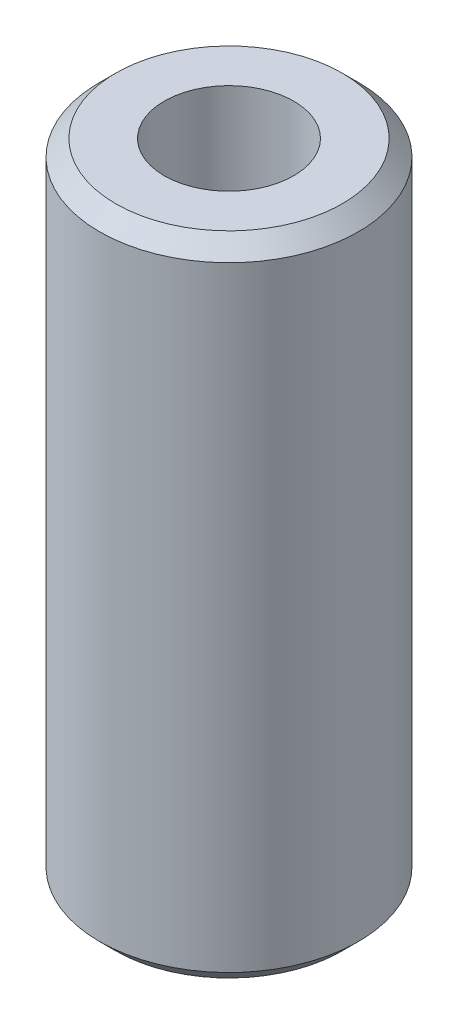
ISO-10303-21;
HEADER;
FILE_DESCRIPTION(('STEP AP214'),'2;1');
FILE_NAME('part.step','',(''),(''),'','','');
FILE_SCHEMA(('AUTOMOTIVE_DESIGN { 1 0 10303 214 1 1 1 1 }'));
ENDSEC;
DATA;
#1=APPLICATION_CONTEXT('core data for automotive mechanical design processes');
#2=APPLICATION_PROTOCOL_DEFINITION('international standard','automotive_design',2000,#1);
#3=PRODUCT_CONTEXT('',#1,'mechanical');
#4=PRODUCT('Part','Part','',(#3));
#5=PRODUCT_RELATED_PRODUCT_CATEGORY('part','',(#4));
#6=PRODUCT_DEFINITION_FORMATION('','',#4);
#7=PRODUCT_DEFINITION_CONTEXT('part definition',#1,'design');
#8=PRODUCT_DEFINITION('design','',#6,#7);
#9=PRODUCT_DEFINITION_SHAPE('','',#8);
#10=(LENGTH_UNIT() NAMED_UNIT(*) SI_UNIT(.MILLI.,.METRE.));
#11=(NAMED_UNIT(*) PLANE_ANGLE_UNIT() SI_UNIT($,.RADIAN.));
#12=(NAMED_UNIT(*) SI_UNIT($,.STERADIAN.) SOLID_ANGLE_UNIT());
#13=UNCERTAINTY_MEASURE_WITH_UNIT(LENGTH_MEASURE(1.E-05),#10,'distance_accuracy_value','');
#14=(GEOMETRIC_REPRESENTATION_CONTEXT(3) GLOBAL_UNCERTAINTY_ASSIGNED_CONTEXT((#13)) GLOBAL_UNIT_ASSIGNED_CONTEXT((#10,
#11,#12)) REPRESENTATION_CONTEXT('',''));
#15=CARTESIAN_POINT('',(0.,0.,0.));
#16=DIRECTION('',(0.,0.,1.));
#17=DIRECTION('',(1.,0.,0.));
#18=AXIS2_PLACEMENT_3D('',#15,#16,#17);
#19=CARTESIAN_POINT('',(0.,20.,0.));
#20=DIRECTION('',(0.,1.,0.));
#21=DIRECTION('',(0.,0.,1.));
#22=AXIS2_PLACEMENT_3D('',#19,#20,#21);
#23=PLANE('',#22);
#24=CARTESIAN_POINT('',(0.,20.,0.));
#25=DIRECTION('',(0.,1.,0.));
#26=DIRECTION('',(0.,0.,1.));
#27=AXIS2_PLACEMENT_3D('',#24,#25,#26);
#28=CIRCLE('',#27,3.5);
#29=CARTESIAN_POINT('',(0.,20.,3.5));
#30=VERTEX_POINT('',#29);
#31=EDGE_CURVE('E10',#30,#30,#28,.T.);
#32=ORIENTED_EDGE('',*,*,#31,.T.);
#33=EDGE_LOOP('',(#32));
#34=FACE_BOUND('',#33,.T.);
#35=CARTESIAN_POINT('',(0.,20.,0.));
#36=DIRECTION('',(0.,1.,0.));
#37=DIRECTION('',(0.,0.,1.));
#38=AXIS2_PLACEMENT_3D('',#35,#36,#37);
#39=CIRCLE('',#38,2.);
#40=CARTESIAN_POINT('',(0.,20.,2.));
#41=VERTEX_POINT('',#40);
#42=EDGE_CURVE('E60',#41,#41,#39,.T.);
#43=ORIENTED_EDGE('',*,*,#42,.F.);
#44=EDGE_LOOP('',(#43));
#45=FACE_BOUND('',#44,.T.);
#46=ADVANCED_FACE('F39',(#34,#45),#23,.T.);
#47=CARTESIAN_POINT('',(0.,0.,0.));
#48=DIRECTION('',(0.,1.,0.));
#49=DIRECTION('',(0.,0.,1.));
#50=AXIS2_PLACEMENT_3D('',#47,#48,#49);
#51=PLANE('',#50);
#52=CARTESIAN_POINT('',(0.,0.,0.));
#53=DIRECTION('',(0.,1.,0.));
#54=DIRECTION('',(0.,0.,1.));
#55=AXIS2_PLACEMENT_3D('',#52,#53,#54);
#56=CIRCLE('',#55,3.49999999999999);
#57=CARTESIAN_POINT('',(0.,0.,3.49999999999999));
#58=VERTEX_POINT('',#57);
#59=EDGE_CURVE('E47',#58,#58,#56,.F.);
#60=ORIENTED_EDGE('',*,*,#59,.T.);
#61=EDGE_LOOP('',(#60));
#62=FACE_BOUND('',#61,.T.);
#63=CARTESIAN_POINT('',(0.,0.,0.));
#64=DIRECTION('',(0.,1.,0.));
#65=DIRECTION('',(0.,0.,1.));
#66=AXIS2_PLACEMENT_3D('',#63,#64,#65);
#67=CIRCLE('',#66,2.);
#68=CARTESIAN_POINT('',(0.,0.,2.));
#69=VERTEX_POINT('',#68);
#70=EDGE_CURVE('E61',#69,#69,#67,.T.);
#71=ORIENTED_EDGE('',*,*,#70,.T.);
#72=EDGE_LOOP('',(#71));
#73=FACE_BOUND('',#72,.T.);
#74=ADVANCED_FACE('F71',(#62,#73),#51,.F.);
#75=CARTESIAN_POINT('',(0.,20.,0.));
#76=DIRECTION('',(0.,-1.,0.));
#77=DIRECTION('',(0.,0.,-1.));
#78=AXIS2_PLACEMENT_3D('',#75,#76,#77);
#79=CYLINDRICAL_SURFACE('',#78,4.);
#80=CARTESIAN_POINT('',(0.,0.500000000000011,0.));
#81=DIRECTION('',(0.,1.,0.));
#82=DIRECTION('',(0.,0.,1.));
#83=AXIS2_PLACEMENT_3D('',#80,#81,#82);
#84=CIRCLE('',#83,4.);
#85=CARTESIAN_POINT('',(0.,0.500000000000011,4.));
#86=VERTEX_POINT('',#85);
#87=EDGE_CURVE('E51',#86,#86,#84,.T.);
#88=ORIENTED_EDGE('',*,*,#87,.T.);
#89=EDGE_LOOP('',(#88));
#90=FACE_BOUND('',#89,.T.);
#91=CARTESIAN_POINT('',(0.,19.5,0.));
#92=DIRECTION('',(0.,1.,0.));
#93=DIRECTION('',(0.,0.,1.));
#94=AXIS2_PLACEMENT_3D('',#91,#92,#93);
#95=CIRCLE('',#94,4.);
#96=CARTESIAN_POINT('',(0.,19.5,4.));
#97=VERTEX_POINT('',#96);
#98=EDGE_CURVE('E55',#97,#97,#95,.F.);
#99=ORIENTED_EDGE('',*,*,#98,.T.);
#100=EDGE_LOOP('',(#99));
#101=FACE_BOUND('',#100,.T.);
#102=ADVANCED_FACE('F77',(#90,#101),#79,.T.);
#103=CARTESIAN_POINT('',(0.,20.,0.));
#104=DIRECTION('',(0.,-1.,0.));
#105=DIRECTION('',(0.,0.,-1.));
#106=AXIS2_PLACEMENT_3D('',#103,#104,#105);
#107=CYLINDRICAL_SURFACE('',#106,2.);
#108=ORIENTED_EDGE('',*,*,#42,.T.);
#109=EDGE_LOOP('',(#108));
#110=FACE_BOUND('',#109,.T.);
#111=ORIENTED_EDGE('',*,*,#70,.F.);
#112=EDGE_LOOP('',(#111));
#113=FACE_BOUND('',#112,.T.);
#114=ADVANCED_FACE('F67',(#110,#113),#107,.F.);
#115=CARTESIAN_POINT('',(0.,0.500000000000011,0.));
#116=DIRECTION('',(0.,1.,0.));
#117=DIRECTION('',(0.,0.,1.));
#118=AXIS2_PLACEMENT_3D('',#115,#116,#117);
#119=CONICAL_SURFACE('',#118,4.,0.785398163397452);
#120=ORIENTED_EDGE('',*,*,#59,.F.);
#121=EDGE_LOOP('',(#120));
#122=FACE_BOUND('',#121,.T.);
#123=ORIENTED_EDGE('',*,*,#87,.F.);
#124=EDGE_LOOP('',(#123));
#125=FACE_BOUND('',#124,.T.);
#126=ADVANCED_FACE('F84',(#122,#125),#119,.T.);
#127=CARTESIAN_POINT('',(0.,20.,0.));
#128=DIRECTION('',(0.,-1.,0.));
#129=DIRECTION('',(0.,0.,-1.));
#130=AXIS2_PLACEMENT_3D('',#127,#128,#129);
#131=CONICAL_SURFACE('',#130,3.5,0.785398163397445);
#132=ORIENTED_EDGE('',*,*,#98,.F.);
#133=EDGE_LOOP('',(#132));
#134=FACE_BOUND('',#133,.T.);
#135=ORIENTED_EDGE('',*,*,#31,.F.);
#136=EDGE_LOOP('',(#135));
#137=FACE_BOUND('',#136,.T.);
#138=ADVANCED_FACE('F42',(#134,#137),#131,.T.);
#139=CLOSED_SHELL('',(#46,#74,#102,#114,#126,#138));
#140=MANIFOLD_SOLID_BREP('B2',#139);
#141=ADVANCED_BREP_SHAPE_REPRESENTATION('',(#18,#140),#14);
#142=SHAPE_DEFINITION_REPRESENTATION(#9,#141);
ENDSEC;
END-ISO-10303-21;
